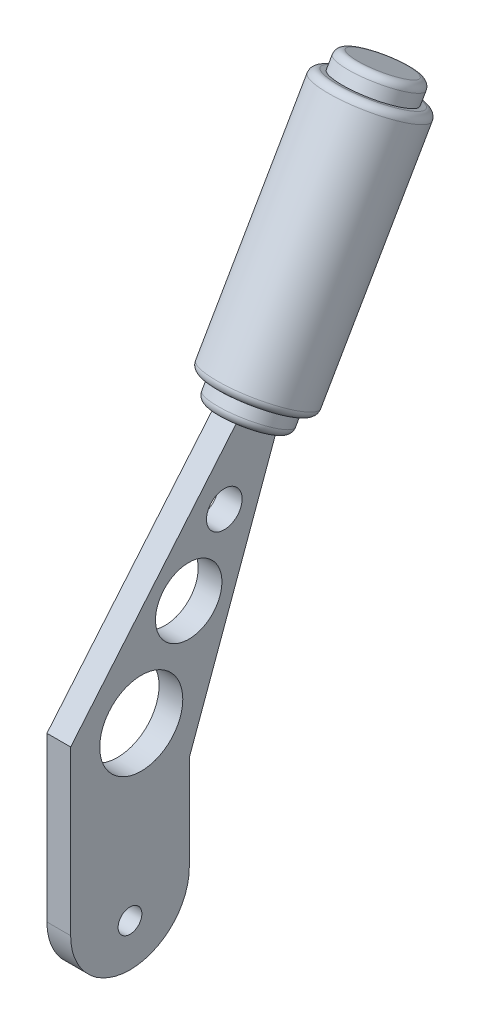
ISO-10303-21;
HEADER;
FILE_DESCRIPTION(('STEP AP214'),'2;1');
FILE_NAME('part.step','',(''),(''),'','','');
FILE_SCHEMA(('AUTOMOTIVE_DESIGN { 1 0 10303 214 1 1 1 1 }'));
ENDSEC;
DATA;
#1=APPLICATION_CONTEXT('core data for automotive mechanical design processes');
#2=APPLICATION_PROTOCOL_DEFINITION('international standard','automotive_design',2000,#1);
#3=PRODUCT_CONTEXT('',#1,'mechanical');
#4=PRODUCT('Part','Part','',(#3));
#5=PRODUCT_RELATED_PRODUCT_CATEGORY('part','',(#4));
#6=PRODUCT_DEFINITION_FORMATION('','',#4);
#7=PRODUCT_DEFINITION_CONTEXT('part definition',#1,'design');
#8=PRODUCT_DEFINITION('design','',#6,#7);
#9=PRODUCT_DEFINITION_SHAPE('','',#8);
#10=(LENGTH_UNIT() NAMED_UNIT(*) SI_UNIT(.MILLI.,.METRE.));
#11=(NAMED_UNIT(*) PLANE_ANGLE_UNIT() SI_UNIT($,.RADIAN.));
#12=(NAMED_UNIT(*) SI_UNIT($,.STERADIAN.) SOLID_ANGLE_UNIT());
#13=UNCERTAINTY_MEASURE_WITH_UNIT(LENGTH_MEASURE(1.E-05),#10,'distance_accuracy_value','');
#14=(GEOMETRIC_REPRESENTATION_CONTEXT(3) GLOBAL_UNCERTAINTY_ASSIGNED_CONTEXT((#13)) GLOBAL_UNIT_ASSIGNED_CONTEXT((#10,
#11,#12)) REPRESENTATION_CONTEXT('',''));
#15=CARTESIAN_POINT('',(0.,0.,0.));
#16=DIRECTION('',(0.,0.,1.));
#17=DIRECTION('',(1.,0.,0.));
#18=AXIS2_PLACEMENT_3D('',#15,#16,#17);
#19=CARTESIAN_POINT('',(-5.,0.,0.));
#20=DIRECTION('',(1.,0.,0.));
#21=DIRECTION('',(0.,0.,-1.));
#22=AXIS2_PLACEMENT_3D('',#19,#20,#21);
#23=CYLINDRICAL_SURFACE('',#22,25.);
#24=DIRECTION('',(1.,0.,0.));
#25=VECTOR('',#24,1.);
#26=CARTESIAN_POINT('',(-5.,0.,-25.));
#27=LINE('',#26,#25);
#28=CARTESIAN_POINT('',(-5.,0.,-25.));
#29=VERTEX_POINT('',#28);
#30=CARTESIAN_POINT('',(5.,0.,-25.));
#31=VERTEX_POINT('',#30);
#32=EDGE_CURVE('E130',#29,#31,#27,.T.);
#33=ORIENTED_EDGE('',*,*,#32,.T.);
#34=CARTESIAN_POINT('',(5.,0.,0.));
#35=DIRECTION('',(1.,0.,0.));
#36=DIRECTION('',(0.,0.,1.));
#37=AXIS2_PLACEMENT_3D('',#34,#35,#36);
#38=CIRCLE('',#37,25.);
#39=CARTESIAN_POINT('',(5.,0.,25.));
#40=VERTEX_POINT('',#39);
#41=EDGE_CURVE('E210',#40,#31,#38,.T.);
#42=ORIENTED_EDGE('',*,*,#41,.F.);
#43=DIRECTION('',(1.,0.,0.));
#44=VECTOR('',#43,1.);
#45=CARTESIAN_POINT('',(-5.,0.,25.));
#46=LINE('',#45,#44);
#47=CARTESIAN_POINT('',(-5.,0.,25.));
#48=VERTEX_POINT('',#47);
#49=EDGE_CURVE('E57',#48,#40,#46,.T.);
#50=ORIENTED_EDGE('',*,*,#49,.F.);
#51=CARTESIAN_POINT('',(-5.,0.,0.));
#52=DIRECTION('',(1.,0.,0.));
#53=DIRECTION('',(0.,0.,1.));
#54=AXIS2_PLACEMENT_3D('',#51,#52,#53);
#55=CIRCLE('',#54,25.);
#56=EDGE_CURVE('E247',#48,#29,#55,.T.);
#57=ORIENTED_EDGE('',*,*,#56,.T.);
#58=EDGE_LOOP('',(#33,#42,#50,#57));
#59=FACE_BOUND('',#58,.T.);
#60=ADVANCED_FACE('F41',(#59),#23,.T.);
#61=CARTESIAN_POINT('',(-5.,0.,25.));
#62=DIRECTION('',(0.,0.,1.));
#63=DIRECTION('',(1.,0.,0.));
#64=AXIS2_PLACEMENT_3D('',#61,#62,#63);
#65=PLANE('',#64);
#66=ORIENTED_EDGE('',*,*,#49,.T.);
#67=DIRECTION('',(0.,-1.,0.));
#68=VECTOR('',#67,1.);
#69=CARTESIAN_POINT('',(5.,0.,25.));
#70=LINE('',#69,#68);
#71=CARTESIAN_POINT('',(5.,68.8675134594813,25.));
#72=VERTEX_POINT('',#71);
#73=EDGE_CURVE('E227',#72,#40,#70,.T.);
#74=ORIENTED_EDGE('',*,*,#73,.F.);
#75=DIRECTION('',(1.,0.,0.));
#76=VECTOR('',#75,1.);
#77=CARTESIAN_POINT('',(-5.,68.8675134594813,25.));
#78=LINE('',#77,#76);
#79=CARTESIAN_POINT('',(-5.,68.8675134594813,25.));
#80=VERTEX_POINT('',#79);
#81=EDGE_CURVE('E65',#80,#72,#78,.T.);
#82=ORIENTED_EDGE('',*,*,#81,.F.);
#83=DIRECTION('',(0.,-1.,0.));
#84=VECTOR('',#83,1.);
#85=CARTESIAN_POINT('',(-5.,0.,25.));
#86=LINE('',#85,#84);
#87=EDGE_CURVE('E103',#80,#48,#86,.T.);
#88=ORIENTED_EDGE('',*,*,#87,.T.);
#89=EDGE_LOOP('',(#66,#74,#82,#88));
#90=FACE_BOUND('',#89,.T.);
#91=ADVANCED_FACE('F259',(#90),#65,.T.);
#92=CARTESIAN_POINT('',(-5.,68.8675134594813,25.));
#93=DIRECTION('',(0.,0.642787609686543,0.766044443118975));
#94=DIRECTION('',(0.,-0.766044443118975,0.642787609686543));
#95=AXIS2_PLACEMENT_3D('',#92,#93,#94);
#96=PLANE('',#95);
#97=ORIENTED_EDGE('',*,*,#81,.T.);
#98=DIRECTION('',(0.,-0.766044443118975,0.642787609686543));
#99=VECTOR('',#98,1.);
#100=CARTESIAN_POINT('',(5.,68.8675134594813,25.));
#101=LINE('',#100,#99);
#102=CARTESIAN_POINT('',(5.,152.101060942083,-44.8412389942287));
#103=VERTEX_POINT('',#102);
#104=EDGE_CURVE('E112',#103,#72,#101,.T.);
#105=ORIENTED_EDGE('',*,*,#104,.F.);
#106=DIRECTION('',(1.,0.,0.));
#107=VECTOR('',#106,1.);
#108=CARTESIAN_POINT('',(-5.,152.101060942083,-44.8412389942287));
#109=LINE('',#108,#107);
#110=CARTESIAN_POINT('',(-5.,152.101060942083,-44.8412389942287));
#111=VERTEX_POINT('',#110);
#112=EDGE_CURVE('E109',#111,#103,#109,.T.);
#113=ORIENTED_EDGE('',*,*,#112,.F.);
#114=DIRECTION('',(0.,-0.766044443118975,0.642787609686543));
#115=VECTOR('',#114,1.);
#116=CARTESIAN_POINT('',(-5.,68.8675134594813,25.));
#117=LINE('',#116,#115);
#118=EDGE_CURVE('E96',#111,#80,#117,.T.);
#119=ORIENTED_EDGE('',*,*,#118,.T.);
#120=EDGE_LOOP('',(#97,#105,#113,#119));
#121=FACE_BOUND('',#120,.T.);
#122=ADVANCED_FACE('F110',(#121),#96,.T.);
#123=CARTESIAN_POINT('',(-5.,142.101060942083,-62.1617470699175));
#124=DIRECTION('',(0.,-0.342020143325666,-0.93969262078591));
#125=DIRECTION('',(0.,0.93969262078591,-0.342020143325666));
#126=AXIS2_PLACEMENT_3D('',#123,#124,#125);
#127=PLANE('',#126);
#128=DIRECTION('',(1.,0.,0.));
#129=VECTOR('',#128,1.);
#130=CARTESIAN_POINT('',(-5.,142.101060942083,-62.1617470699175));
#131=LINE('',#130,#129);
#132=CARTESIAN_POINT('',(-5.,142.101060942083,-62.1617470699175));
#133=VERTEX_POINT('',#132);
#134=CARTESIAN_POINT('',(5.,142.101060942083,-62.1617470699175));
#135=VERTEX_POINT('',#134);
#136=EDGE_CURVE('E116',#133,#135,#131,.T.);
#137=ORIENTED_EDGE('',*,*,#136,.T.);
#138=DIRECTION('',(0.,0.93969262078591,-0.342020143325666));
#139=VECTOR('',#138,1.);
#140=CARTESIAN_POINT('',(5.,142.101060942083,-62.1617470699175));
#141=LINE('',#140,#139);
#142=CARTESIAN_POINT('',(5.,40.,-25.));
#143=VERTEX_POINT('',#142);
#144=EDGE_CURVE('E218',#143,#135,#141,.T.);
#145=ORIENTED_EDGE('',*,*,#144,.F.);
#146=DIRECTION('',(1.,0.,0.));
#147=VECTOR('',#146,1.);
#148=CARTESIAN_POINT('',(-5.,40.,-25.));
#149=LINE('',#148,#147);
#150=CARTESIAN_POINT('',(-5.,40.,-25.));
#151=VERTEX_POINT('',#150);
#152=EDGE_CURVE('E138',#151,#143,#149,.T.);
#153=ORIENTED_EDGE('',*,*,#152,.F.);
#154=DIRECTION('',(0.,0.93969262078591,-0.342020143325666));
#155=VECTOR('',#154,1.);
#156=CARTESIAN_POINT('',(-5.,142.101060942083,-62.1617470699175));
#157=LINE('',#156,#155);
#158=EDGE_CURVE('E121',#151,#133,#157,.T.);
#159=ORIENTED_EDGE('',*,*,#158,.T.);
#160=EDGE_LOOP('',(#137,#145,#153,#159));
#161=FACE_BOUND('',#160,.T.);
#162=ADVANCED_FACE('F266',(#161),#127,.T.);
#163=CARTESIAN_POINT('',(-5.,0.,-25.));
#164=DIRECTION('',(0.,0.,-1.));
#165=DIRECTION('',(-1.,0.,0.));
#166=AXIS2_PLACEMENT_3D('',#163,#164,#165);
#167=PLANE('',#166);
#168=ORIENTED_EDGE('',*,*,#152,.T.);
#169=DIRECTION('',(0.,1.,0.));
#170=VECTOR('',#169,1.);
#171=CARTESIAN_POINT('',(5.,0.,-25.));
#172=LINE('',#171,#170);
#173=EDGE_CURVE('E214',#31,#143,#172,.T.);
#174=ORIENTED_EDGE('',*,*,#173,.F.);
#175=ORIENTED_EDGE('',*,*,#32,.F.);
#176=DIRECTION('',(0.,1.,0.));
#177=VECTOR('',#176,1.);
#178=CARTESIAN_POINT('',(-5.,0.,-25.));
#179=LINE('',#178,#177);
#180=EDGE_CURVE('E124',#29,#151,#179,.T.);
#181=ORIENTED_EDGE('',*,*,#180,.T.);
#182=EDGE_LOOP('',(#168,#174,#175,#181));
#183=FACE_BOUND('',#182,.T.);
#184=ADVANCED_FACE('F253',(#183),#167,.T.);
#185=CARTESIAN_POINT('',(-5.,0.,0.));
#186=DIRECTION('',(-1.,0.,0.));
#187=DIRECTION('',(0.,0.,1.));
#188=AXIS2_PLACEMENT_3D('',#185,#186,#187);
#189=PLANE('',#188);
#190=CARTESIAN_POINT('',(-5.,-7.,0.));
#191=DIRECTION('',(1.,0.,0.));
#192=DIRECTION('',(0.,0.,-1.));
#193=AXIS2_PLACEMENT_3D('',#190,#191,#192);
#194=CIRCLE('',#193,5.);
#195=CARTESIAN_POINT('',(-5.,-7.,-5.));
#196=VERTEX_POINT('',#195);
#197=EDGE_CURVE('E231',#196,#196,#194,.T.);
#198=ORIENTED_EDGE('',*,*,#197,.T.);
#199=EDGE_LOOP('',(#198));
#200=FACE_BOUND('',#199,.T.);
#201=CARTESIAN_POINT('',(-5.,62.6635840731006,-4.75149303207303));
#202=DIRECTION('',(1.,0.,0.));
#203=DIRECTION('',(0.,0.,-1.));
#204=AXIS2_PLACEMENT_3D('',#201,#202,#203);
#205=CIRCLE('',#204,17.5);
#206=CARTESIAN_POINT('',(-5.,62.6635840731006,-22.251493032073));
#207=VERTEX_POINT('',#206);
#208=EDGE_CURVE('E235',#207,#207,#205,.T.);
#209=ORIENTED_EDGE('',*,*,#208,.T.);
#210=EDGE_LOOP('',(#209));
#211=FACE_BOUND('',#210,.T.);
#212=CARTESIAN_POINT('',(-5.,97.3046002244782,-24.751493032073));
#213=DIRECTION('',(1.,0.,0.));
#214=DIRECTION('',(0.,0.,-1.));
#215=AXIS2_PLACEMENT_3D('',#212,#213,#214);
#216=CIRCLE('',#215,14.);
#217=CARTESIAN_POINT('',(-5.,97.3046002244782,-38.7514930320731));
#218=VERTEX_POINT('',#217);
#219=EDGE_CURVE('E239',#218,#218,#216,.T.);
#220=ORIENTED_EDGE('',*,*,#219,.T.);
#221=EDGE_LOOP('',(#220));
#222=FACE_BOUND('',#221,.T.);
#223=CARTESIAN_POINT('',(-5.,123.285362338011,-39.7514930320731));
#224=DIRECTION('',(1.,0.,0.));
#225=DIRECTION('',(0.,0.,-1.));
#226=AXIS2_PLACEMENT_3D('',#223,#224,#225);
#227=CIRCLE('',#226,7.50000000000002);
#228=CARTESIAN_POINT('',(-5.,123.285362338011,-47.2514930320731));
#229=VERTEX_POINT('',#228);
#230=EDGE_CURVE('E243',#229,#229,#227,.T.);
#231=ORIENTED_EDGE('',*,*,#230,.T.);
#232=EDGE_LOOP('',(#231));
#233=FACE_BOUND('',#232,.T.);
#234=ORIENTED_EDGE('',*,*,#56,.F.);
#235=ORIENTED_EDGE('',*,*,#87,.F.);
#236=ORIENTED_EDGE('',*,*,#118,.F.);
#237=DIRECTION('',(0.,0.5,0.866025403784438));
#238=VECTOR('',#237,1.);
#239=CARTESIAN_POINT('',(-5.,152.101060942083,-44.8412389942287));
#240=LINE('',#239,#238);
#241=EDGE_CURVE('E101',#133,#111,#240,.T.);
#242=ORIENTED_EDGE('',*,*,#241,.F.);
#243=ORIENTED_EDGE('',*,*,#158,.F.);
#244=ORIENTED_EDGE('',*,*,#180,.F.);
#245=EDGE_LOOP('',(#234,#235,#236,#242,#243,#244));
#246=FACE_BOUND('',#245,.T.);
#247=ADVANCED_FACE('F98',(#200,#211,#222,#233,#246),#189,.T.);
#248=CARTESIAN_POINT('',(-5.,123.285362338011,-39.7514930320731));
#249=DIRECTION('',(1.,0.,0.));
#250=DIRECTION('',(0.,0.,-1.));
#251=AXIS2_PLACEMENT_3D('',#248,#249,#250);
#252=CYLINDRICAL_SURFACE('',#251,7.50000000000002);
#253=ORIENTED_EDGE('',*,*,#230,.F.);
#254=EDGE_LOOP('',(#253));
#255=FACE_BOUND('',#254,.T.);
#256=CARTESIAN_POINT('',(5.,123.285362338011,-39.7514930320731));
#257=DIRECTION('',(1.,0.,0.));
#258=DIRECTION('',(0.,0.,-1.));
#259=AXIS2_PLACEMENT_3D('',#256,#257,#258);
#260=CIRCLE('',#259,7.50000000000002);
#261=CARTESIAN_POINT('',(5.,123.285362338011,-47.2514930320731));
#262=VERTEX_POINT('',#261);
#263=EDGE_CURVE('E206',#262,#262,#260,.T.);
#264=ORIENTED_EDGE('',*,*,#263,.T.);
#265=EDGE_LOOP('',(#264));
#266=FACE_BOUND('',#265,.T.);
#267=ADVANCED_FACE('F323',(#255,#266),#252,.F.);
#268=CARTESIAN_POINT('',(-5.,97.3046002244782,-24.751493032073));
#269=DIRECTION('',(1.,0.,0.));
#270=DIRECTION('',(0.,0.,-1.));
#271=AXIS2_PLACEMENT_3D('',#268,#269,#270);
#272=CYLINDRICAL_SURFACE('',#271,14.);
#273=ORIENTED_EDGE('',*,*,#219,.F.);
#274=EDGE_LOOP('',(#273));
#275=FACE_BOUND('',#274,.T.);
#276=CARTESIAN_POINT('',(5.,97.3046002244782,-24.751493032073));
#277=DIRECTION('',(1.,0.,0.));
#278=DIRECTION('',(0.,0.,-1.));
#279=AXIS2_PLACEMENT_3D('',#276,#277,#278);
#280=CIRCLE('',#279,14.);
#281=CARTESIAN_POINT('',(5.,97.3046002244782,-38.7514930320731));
#282=VERTEX_POINT('',#281);
#283=EDGE_CURVE('E202',#282,#282,#280,.T.);
#284=ORIENTED_EDGE('',*,*,#283,.T.);
#285=EDGE_LOOP('',(#284));
#286=FACE_BOUND('',#285,.T.);
#287=ADVANCED_FACE('F320',(#275,#286),#272,.F.);
#288=CARTESIAN_POINT('',(-5.,62.6635840731006,-4.75149303207303));
#289=DIRECTION('',(1.,0.,0.));
#290=DIRECTION('',(0.,0.,-1.));
#291=AXIS2_PLACEMENT_3D('',#288,#289,#290);
#292=CYLINDRICAL_SURFACE('',#291,17.5);
#293=ORIENTED_EDGE('',*,*,#208,.F.);
#294=EDGE_LOOP('',(#293));
#295=FACE_BOUND('',#294,.T.);
#296=CARTESIAN_POINT('',(5.,62.6635840731006,-4.75149303207303));
#297=DIRECTION('',(1.,0.,0.));
#298=DIRECTION('',(0.,0.,-1.));
#299=AXIS2_PLACEMENT_3D('',#296,#297,#298);
#300=CIRCLE('',#299,17.5);
#301=CARTESIAN_POINT('',(5.,62.6635840731006,-22.251493032073));
#302=VERTEX_POINT('',#301);
#303=EDGE_CURVE('E198',#302,#302,#300,.T.);
#304=ORIENTED_EDGE('',*,*,#303,.T.);
#305=EDGE_LOOP('',(#304));
#306=FACE_BOUND('',#305,.T.);
#307=ADVANCED_FACE('F316',(#295,#306),#292,.F.);
#308=CARTESIAN_POINT('',(-5.,-7.,0.));
#309=DIRECTION('',(1.,0.,0.));
#310=DIRECTION('',(0.,0.,-1.));
#311=AXIS2_PLACEMENT_3D('',#308,#309,#310);
#312=CYLINDRICAL_SURFACE('',#311,5.);
#313=ORIENTED_EDGE('',*,*,#197,.F.);
#314=EDGE_LOOP('',(#313));
#315=FACE_BOUND('',#314,.T.);
#316=CARTESIAN_POINT('',(5.,-7.,0.));
#317=DIRECTION('',(1.,0.,0.));
#318=DIRECTION('',(0.,0.,-1.));
#319=AXIS2_PLACEMENT_3D('',#316,#317,#318);
#320=CIRCLE('',#319,5.);
#321=CARTESIAN_POINT('',(5.,-7.,-5.));
#322=VERTEX_POINT('',#321);
#323=EDGE_CURVE('E192',#322,#322,#320,.T.);
#324=ORIENTED_EDGE('',*,*,#323,.T.);
#325=EDGE_LOOP('',(#324));
#326=FACE_BOUND('',#325,.T.);
#327=ADVANCED_FACE('F299',(#315,#326),#312,.F.);
#328=CARTESIAN_POINT('',(5.,0.,0.));
#329=DIRECTION('',(-1.,0.,0.));
#330=DIRECTION('',(0.,0.,1.));
#331=AXIS2_PLACEMENT_3D('',#328,#329,#330);
#332=PLANE('',#331);
#333=ORIENTED_EDGE('',*,*,#41,.T.);
#334=ORIENTED_EDGE('',*,*,#173,.T.);
#335=ORIENTED_EDGE('',*,*,#144,.T.);
#336=DIRECTION('',(0.,0.5,0.866025403784438));
#337=VECTOR('',#336,1.);
#338=CARTESIAN_POINT('',(5.,152.101060942083,-44.8412389942287));
#339=LINE('',#338,#337);
#340=EDGE_CURVE('E222',#135,#103,#339,.T.);
#341=ORIENTED_EDGE('',*,*,#340,.T.);
#342=ORIENTED_EDGE('',*,*,#104,.T.);
#343=ORIENTED_EDGE('',*,*,#73,.T.);
#344=EDGE_LOOP('',(#333,#334,#335,#341,#342,#343));
#345=FACE_BOUND('',#344,.T.);
#346=ORIENTED_EDGE('',*,*,#263,.F.);
#347=EDGE_LOOP('',(#346));
#348=FACE_BOUND('',#347,.T.);
#349=ORIENTED_EDGE('',*,*,#283,.F.);
#350=EDGE_LOOP('',(#349));
#351=FACE_BOUND('',#350,.T.);
#352=ORIENTED_EDGE('',*,*,#303,.F.);
#353=EDGE_LOOP('',(#352));
#354=FACE_BOUND('',#353,.T.);
#355=ORIENTED_EDGE('',*,*,#323,.F.);
#356=EDGE_LOOP('',(#355));
#357=FACE_BOUND('',#356,.T.);
#358=ADVANCED_FACE('F257',(#345,#348,#351,#354,#357),#332,.F.);
#359=CARTESIAN_POINT('',(0.,154.601060942083,-40.5111119753066));
#360=DIRECTION('',(0.,0.866025403784438,-0.5));
#361=DIRECTION('',(0.,0.5,0.866025403784439));
#362=AXIS2_PLACEMENT_3D('',#359,#360,#361);
#363=PLANE('',#362);
#364=CARTESIAN_POINT('',(0.,147.101060942083,-53.5014930320731));
#365=DIRECTION('',(0.,0.866025403784438,-0.5));
#366=DIRECTION('',(0.,0.5,0.866025403784439));
#367=AXIS2_PLACEMENT_3D('',#364,#365,#366);
#368=CIRCLE('',#367,12.);
#369=CARTESIAN_POINT('',(0.,153.101060942083,-43.1091881866599));
#370=VERTEX_POINT('',#369);
#371=EDGE_CURVE('E150',#370,#370,#368,.F.);
#372=ORIENTED_EDGE('',*,*,#371,.T.);
#373=EDGE_LOOP('',(#372));
#374=FACE_BOUND('',#373,.T.);
#375=ORIENTED_EDGE('',*,*,#241,.T.);
#376=ORIENTED_EDGE('',*,*,#112,.T.);
#377=ORIENTED_EDGE('',*,*,#340,.F.);
#378=ORIENTED_EDGE('',*,*,#136,.F.);
#379=EDGE_LOOP('',(#375,#376,#377,#378));
#380=FACE_BOUND('',#379,.T.);
#381=ADVANCED_FACE('F119',(#374,#380),#363,.F.);
#382=CARTESIAN_POINT('',(0.,255.060007781078,-98.5111119753066));
#383=DIRECTION('',(0.,-0.866025403784438,0.5));
#384=DIRECTION('',(0.,-0.5,-0.866025403784439));
#385=AXIS2_PLACEMENT_3D('',#382,#383,#384);
#386=PLANE('',#385);
#387=CARTESIAN_POINT('',(0.,247.560007781078,-111.501493032073));
#388=DIRECTION('',(0.,-0.866025403784438,0.5));
#389=DIRECTION('',(0.,-0.5,-0.866025403784439));
#390=AXIS2_PLACEMENT_3D('',#387,#388,#389);
#391=CIRCLE('',#390,12.);
#392=CARTESIAN_POINT('',(0.,241.560007781078,-121.893797877486));
#393=VERTEX_POINT('',#392);
#394=EDGE_CURVE('E146',#393,#393,#391,.F.);
#395=ORIENTED_EDGE('',*,*,#394,.T.);
#396=EDGE_LOOP('',(#395));
#397=FACE_BOUND('',#396,.T.);
#398=ADVANCED_FACE('F290',(#397),#386,.F.);
#399=CARTESIAN_POINT('',(0.,147.101060942083,-53.5014930320731));
#400=DIRECTION('',(0.,-0.866025403784438,0.5));
#401=DIRECTION('',(0.,-0.5,-0.866025403784439));
#402=AXIS2_PLACEMENT_3D('',#399,#400,#401);
#403=CYLINDRICAL_SURFACE('',#402,15.);
#404=CARTESIAN_POINT('',(0.,244.961931569725,-110.001493032073));
#405=DIRECTION('',(0.,-0.866025403784438,0.5));
#406=DIRECTION('',(0.,-0.5,-0.866025403784439));
#407=AXIS2_PLACEMENT_3D('',#404,#405,#406);
#408=CIRCLE('',#407,15.);
#409=CARTESIAN_POINT('',(0.,237.461931569725,-122.99187408884));
#410=VERTEX_POINT('',#409);
#411=EDGE_CURVE('E133',#410,#410,#408,.T.);
#412=CARTESIAN_POINT('',(0.,240.631804550803,-107.501493032073));
#413=DIRECTION('',(0.,-0.866025403784438,0.5));
#414=DIRECTION('',(0.,-0.5,-0.866025403784439));
#415=AXIS2_PLACEMENT_3D('',#412,#413,#414);
#416=CIRCLE('',#415,15.);
#417=CARTESIAN_POINT('',(0.,233.131804550803,-120.49187408884));
#418=VERTEX_POINT('',#417);
#419=EDGE_CURVE('E188',#418,#418,#416,.T.);
#420=CARTESIAN_POINT('',(0.,237.461931569725,-122.99187408884));
#421=CARTESIAN_POINT('',(0.,237.416826079945,-122.965832422173));
#422=CARTESIAN_POINT('',(0.,237.371720590164,-122.939790755506));
#423=CARTESIAN_POINT('',(0.,237.281509610603,-122.887707422173));
#424=CARTESIAN_POINT('',(0.,237.236404120823,-122.861665755506));
#425=CARTESIAN_POINT('',(0.,237.146193141262,-122.809582422173));
#426=CARTESIAN_POINT('',(0.,237.101087651481,-122.783540755506));
#427=CARTESIAN_POINT('',(0.,237.010876671921,-122.731457422173));
#428=CARTESIAN_POINT('',(0.,236.96577118214,-122.705415755506));
#429=CARTESIAN_POINT('',(0.,236.875560202579,-122.653332422173));
#430=CARTESIAN_POINT('',(0.,236.830454712799,-122.627290755506));
#431=CARTESIAN_POINT('',(0.,236.740243733238,-122.575207422173));
#432=CARTESIAN_POINT('',(0.,236.695138243457,-122.549165755506));
#433=CARTESIAN_POINT('',(0.,236.604927263897,-122.497082422173));
#434=CARTESIAN_POINT('',(0.,236.559821774116,-122.471040755506));
#435=CARTESIAN_POINT('',(0.,236.469610794555,-122.418957422173));
#436=CARTESIAN_POINT('',(0.,236.424505304775,-122.392915755506));
#437=CARTESIAN_POINT('',(0.,236.334294325214,-122.340832422173));
#438=CARTESIAN_POINT('',(0.,236.289188835434,-122.314790755506));
#439=CARTESIAN_POINT('',(0.,236.198977855873,-122.262707422173));
#440=CARTESIAN_POINT('',(0.,236.153872366092,-122.236665755506));
#441=CARTESIAN_POINT('',(0.,236.063661386531,-122.184582422173));
#442=CARTESIAN_POINT('',(0.,236.018555896751,-122.158540755506));
#443=CARTESIAN_POINT('',(0.,235.92834491719,-122.106457422173));
#444=CARTESIAN_POINT('',(0.,235.88323942741,-122.080415755506));
#445=CARTESIAN_POINT('',(0.,235.793028447849,-122.028332422173));
#446=CARTESIAN_POINT('',(0.,235.747922958068,-122.002290755506));
#447=CARTESIAN_POINT('',(0.,235.657711978507,-121.950207422173));
#448=CARTESIAN_POINT('',(0.,235.612606488727,-121.924165755506));
#449=CARTESIAN_POINT('',(0.,235.522395509166,-121.872082422173));
#450=CARTESIAN_POINT('',(0.,235.477290019386,-121.846040755506));
#451=CARTESIAN_POINT('',(0.,235.387079039825,-121.793957422173));
#452=CARTESIAN_POINT('',(0.,235.341973550044,-121.767915755506));
#453=CARTESIAN_POINT('',(0.,235.251762570483,-121.715832422173));
#454=CARTESIAN_POINT('',(0.,235.206657080703,-121.689790755506));
#455=CARTESIAN_POINT('',(0.,235.116446101142,-121.637707422173));
#456=CARTESIAN_POINT('',(0.,235.071340611362,-121.611665755506));
#457=CARTESIAN_POINT('',(0.,234.981129631801,-121.559582422173));
#458=CARTESIAN_POINT('',(0.,234.93602414202,-121.533540755506));
#459=CARTESIAN_POINT('',(0.,234.845813162459,-121.481457422173));
#460=CARTESIAN_POINT('',(0.,234.800707672679,-121.455415755506));
#461=CARTESIAN_POINT('',(0.,234.710496693118,-121.403332422173));
#462=CARTESIAN_POINT('',(0.,234.665391203338,-121.377290755506));
#463=CARTESIAN_POINT('',(0.,234.575180223777,-121.325207422173));
#464=CARTESIAN_POINT('',(0.,234.530074733996,-121.299165755506));
#465=CARTESIAN_POINT('',(0.,234.439863754435,-121.247082422173));
#466=CARTESIAN_POINT('',(0.,234.394758264655,-121.221040755506));
#467=CARTESIAN_POINT('',(0.,234.304547285094,-121.168957422173));
#468=CARTESIAN_POINT('',(0.,234.259441795314,-121.142915755506));
#469=CARTESIAN_POINT('',(0.,234.169230815753,-121.090832422173));
#470=CARTESIAN_POINT('',(0.,234.124125325972,-121.064790755506));
#471=CARTESIAN_POINT('',(0.,234.033914346412,-121.012707422173));
#472=CARTESIAN_POINT('',(0.,233.988808856631,-120.986665755506));
#473=CARTESIAN_POINT('',(0.,233.89859787707,-120.934582422173));
#474=CARTESIAN_POINT('',(0.,233.85349238729,-120.908540755506));
#475=CARTESIAN_POINT('',(0.,233.763281407729,-120.856457422173));
#476=CARTESIAN_POINT('',(0.,233.718175917948,-120.830415755506));
#477=CARTESIAN_POINT('',(0.,233.627964938388,-120.778332422173));
#478=CARTESIAN_POINT('',(0.,233.582859448607,-120.752290755506));
#479=CARTESIAN_POINT('',(0.,233.492648469046,-120.700207422173));
#480=CARTESIAN_POINT('',(0.,233.447542979266,-120.674165755506));
#481=CARTESIAN_POINT('',(0.,233.357331999705,-120.622082422173));
#482=CARTESIAN_POINT('',(0.,233.312226509924,-120.596040755506));
#483=CARTESIAN_POINT('',(0.,233.222015530364,-120.543957422173));
#484=CARTESIAN_POINT('',(0.,233.176910040583,-120.517915755506));
#485=CARTESIAN_POINT('',(0.,233.131804550803,-120.49187408884));
#486=B_SPLINE_CURVE_WITH_KNOTS('',3,(#420,#421,#422,#423,#424,#425,#426,#427,#428,#429,#430,
#431,#432,#433,#434,#435,#436,#437,#438,#439,#440,#441,#442,#443,#444,#445,#446,#447,#448,#449,
#450,#451,#452,#453,#454,#455,#456,#457,#458,#459,#460,#461,#462,#463,#464,#465,#466,#467,#468,
#469,#470,#471,#472,#473,#474,#475,#476,#477,#478,#479,#480,#481,#482,#483,#484,#485),
.UNSPECIFIED.,.F.,.F.,(4,2,2,2,2,2,2,2,2,2,2,2,2,2,2,2,2,2,2,2,2,2,2,2,2,2,2,2,2,2,2,2,4),(0.,
0.156249999999994,0.312500000000018,0.468750000000005,0.625000000000006,0.781250000000024,
0.937500000000017,1.09375000000002,1.25000000000003,1.40625000000001,1.56250000000002,
1.71875000000004,1.87500000000001,2.03125000000003,2.18750000000003,2.34375000000002,
2.50000000000004,2.65625000000003,2.81250000000003,2.96875000000005,3.12500000000005,
3.28125000000004,3.43750000000006,3.59375000000005,3.75000000000005,3.90625000000005,
4.06250000000004,4.21875000000006,4.37500000000005,4.53125000000005,4.68750000000007,
4.84375000000006,5.00000000000006),.UNSPECIFIED.);
#487=EDGE_CURVE('BSEAM296',#410,#418,#486,.T.);
#488=ORIENTED_EDGE('',*,*,#411,.T.);
#489=ORIENTED_EDGE('',*,*,#419,.F.);
#490=ORIENTED_EDGE('',*,*,#487,.T.);
#491=ORIENTED_EDGE('',*,*,#487,.F.);
#492=EDGE_LOOP('',(#488,#490,#489,#491));
#493=FACE_BOUND('',#492,.T.);
#494=ADVANCED_FACE('F296',(#493),#403,.T.);
#495=CARTESIAN_POINT('',(0.,250.631804550803,-90.1809849563844));
#496=DIRECTION('',(0.,-0.866025403784438,0.5));
#497=DIRECTION('',(0.,-0.5,-0.866025403784439));
#498=AXIS2_PLACEMENT_3D('',#495,#496,#497);
#499=PLANE('',#498);
#500=CARTESIAN_POINT('',(0.,240.631804550803,-107.501493032073));
#501=DIRECTION('',(0.,-0.866025403784438,0.5));
#502=DIRECTION('',(0.,-0.5,-0.866025403784439));
#503=AXIS2_PLACEMENT_3D('',#500,#501,#502);
#504=CIRCLE('',#503,17.);
#505=CARTESIAN_POINT('',(0.,232.131804550803,-122.223924896409));
#506=VERTEX_POINT('',#505);
#507=EDGE_CURVE('E11',#506,#506,#504,.F.);
#508=ORIENTED_EDGE('',*,*,#507,.T.);
#509=EDGE_LOOP('',(#508));
#510=FACE_BOUND('',#509,.T.);
#511=ORIENTED_EDGE('',*,*,#419,.T.);
#512=EDGE_LOOP('',(#511));
#513=FACE_BOUND('',#512,.T.);
#514=ADVANCED_FACE('F307',(#510,#513),#499,.F.);
#515=CARTESIAN_POINT('',(0.,147.101060942083,-53.5014930320731));
#516=DIRECTION('',(0.,-0.866025403784438,0.5));
#517=DIRECTION('',(0.,-0.5,-0.866025403784439));
#518=AXIS2_PLACEMENT_3D('',#515,#516,#517);
#519=CYLINDRICAL_SURFACE('',#518,20.);
#520=CARTESIAN_POINT('',(0.,156.627340383712,-59.0014930320731));
#521=DIRECTION('',(0.,0.866025403784438,-0.5));
#522=DIRECTION('',(0.,0.5,0.866025403784439));
#523=AXIS2_PLACEMENT_3D('',#520,#521,#522);
#524=CIRCLE('',#523,20.);
#525=CARTESIAN_POINT('',(0.,146.627340383712,-76.3220011077619));
#526=VERTEX_POINT('',#525);
#527=EDGE_CURVE('E50',#526,#526,#524,.T.);
#528=CARTESIAN_POINT('',(0.,238.033728339449,-106.001493032073));
#529=DIRECTION('',(0.,-0.866025403784438,0.5));
#530=DIRECTION('',(0.,-0.5,-0.866025403784439));
#531=AXIS2_PLACEMENT_3D('',#528,#529,#530);
#532=CIRCLE('',#531,20.);
#533=CARTESIAN_POINT('',(0.,228.033728339449,-123.322001107762));
#534=VERTEX_POINT('',#533);
#535=EDGE_CURVE('E162',#534,#534,#532,.T.);
#536=CARTESIAN_POINT('',(0.,146.627340383712,-76.3220011077619));
#537=CARTESIAN_POINT('',(0.,147.475323591584,-76.8115844410953));
#538=CARTESIAN_POINT('',(0.,148.323306799457,-77.3011677744286));
#539=CARTESIAN_POINT('',(0.,150.019273215201,-78.2803344410953));
#540=CARTESIAN_POINT('',(0.,150.867256423073,-78.7699177744286));
#541=CARTESIAN_POINT('',(0.,152.563222838818,-79.7490844410952));
#542=CARTESIAN_POINT('',(0.,153.41120604669,-80.2386677744286));
#543=CARTESIAN_POINT('',(0.,155.107172462435,-81.2178344410953));
#544=CARTESIAN_POINT('',(0.,155.955155670307,-81.7074177744286));
#545=CARTESIAN_POINT('',(0.,157.651122086052,-82.6865844410953));
#546=CARTESIAN_POINT('',(0.,158.499105293924,-83.1761677744286));
#547=CARTESIAN_POINT('',(0.,160.195071709668,-84.1553344410952));
#548=CARTESIAN_POINT('',(0.,161.043054917541,-84.6449177744286));
#549=CARTESIAN_POINT('',(0.,162.739021333285,-85.6240844410953));
#550=CARTESIAN_POINT('',(0.,163.587004541157,-86.1136677744286));
#551=CARTESIAN_POINT('',(0.,165.282970956902,-87.0928344410953));
#552=CARTESIAN_POINT('',(0.,166.130954164774,-87.5824177744286));
#553=CARTESIAN_POINT('',(0.,167.826920580519,-88.5615844410953));
#554=CARTESIAN_POINT('',(0.,168.674903788391,-89.0511677744286));
#555=CARTESIAN_POINT('',(0.,170.370870204136,-90.0303344410953));
#556=CARTESIAN_POINT('',(0.,171.218853412008,-90.5199177744286));
#557=CARTESIAN_POINT('',(0.,172.914819827752,-91.4990844410953));
#558=CARTESIAN_POINT('',(0.,173.762803035625,-91.9886677744286));
#559=CARTESIAN_POINT('',(0.,175.458769451369,-92.9678344410953));
#560=CARTESIAN_POINT('',(0.,176.306752659241,-93.4574177744286));
#561=CARTESIAN_POINT('',(0.,178.002719074986,-94.4365844410953));
#562=CARTESIAN_POINT('',(0.,178.850702282858,-94.9261677744286));
#563=CARTESIAN_POINT('',(0.,180.546668698603,-95.9053344410953));
#564=CARTESIAN_POINT('',(0.,181.394651906475,-96.3949177744286));
#565=CARTESIAN_POINT('',(0.,183.090618322219,-97.3740844410953));
#566=CARTESIAN_POINT('',(0.,183.938601530092,-97.8636677744286));
#567=CARTESIAN_POINT('',(0.,185.634567945836,-98.8428344410953));
#568=CARTESIAN_POINT('',(0.,186.482551153709,-99.3324177744286));
#569=CARTESIAN_POINT('',(0.,188.178517569453,-100.311584441095));
#570=CARTESIAN_POINT('',(0.,189.026500777325,-100.801167774429));
#571=CARTESIAN_POINT('',(0.,190.72246719307,-101.780334441095));
#572=CARTESIAN_POINT('',(0.,191.570450400942,-102.269917774429));
#573=CARTESIAN_POINT('',(0.,193.266416816687,-103.249084441095));
#574=CARTESIAN_POINT('',(0.,194.114400024559,-103.738667774429));
#575=CARTESIAN_POINT('',(0.,195.810366440303,-104.717834441095));
#576=CARTESIAN_POINT('',(0.,196.658349648176,-105.207417774429));
#577=CARTESIAN_POINT('',(0.,198.35431606392,-106.186584441095));
#578=CARTESIAN_POINT('',(0.,199.202299271792,-106.676167774429));
#579=CARTESIAN_POINT('',(0.,200.898265687537,-107.655334441095));
#580=CARTESIAN_POINT('',(0.,201.746248895409,-108.144917774429));
#581=CARTESIAN_POINT('',(0.,203.442215311154,-109.124084441095));
#582=CARTESIAN_POINT('',(0.,204.290198519026,-109.613667774429));
#583=CARTESIAN_POINT('',(0.,205.986164934771,-110.592834441095));
#584=CARTESIAN_POINT('',(0.,206.834148142643,-111.082417774429));
#585=CARTESIAN_POINT('',(0.,208.530114558387,-112.061584441095));
#586=CARTESIAN_POINT('',(0.,209.37809776626,-112.551167774429));
#587=CARTESIAN_POINT('',(0.,211.074064182004,-113.530334441095));
#588=CARTESIAN_POINT('',(0.,211.922047389876,-114.019917774429));
#589=CARTESIAN_POINT('',(0.,213.618013805621,-114.999084441095));
#590=CARTESIAN_POINT('',(0.,214.465997013493,-115.488667774429));
#591=CARTESIAN_POINT('',(0.,216.161963429238,-116.467834441095));
#592=CARTESIAN_POINT('',(0.,217.00994663711,-116.957417774429));
#593=CARTESIAN_POINT('',(0.,218.705913052855,-117.936584441095));
#594=CARTESIAN_POINT('',(0.,219.553896260727,-118.426167774429));
#595=CARTESIAN_POINT('',(0.,221.249862676471,-119.405334441095));
#596=CARTESIAN_POINT('',(0.,222.097845884344,-119.894917774429));
#597=CARTESIAN_POINT('',(0.,223.793812300088,-120.874084441095));
#598=CARTESIAN_POINT('',(0.,224.64179550796,-121.363667774429));
#599=CARTESIAN_POINT('',(0.,226.337761923705,-122.342834441095));
#600=CARTESIAN_POINT('',(0.,227.185745131577,-122.832417774429));
#601=CARTESIAN_POINT('',(0.,228.033728339449,-123.322001107762));
#602=B_SPLINE_CURVE_WITH_KNOTS('',3,(#536,#537,#538,#539,#540,#541,#542,#543,#544,#545,#546,
#547,#548,#549,#550,#551,#552,#553,#554,#555,#556,#557,#558,#559,#560,#561,#562,#563,#564,#565,
#566,#567,#568,#569,#570,#571,#572,#573,#574,#575,#576,#577,#578,#579,#580,#581,#582,#583,#584,
#585,#586,#587,#588,#589,#590,#591,#592,#593,#594,#595,#596,#597,#598,#599,#600,#601),
.UNSPECIFIED.,.F.,.F.,(4,2,2,2,2,2,2,2,2,2,2,2,2,2,2,2,2,2,2,2,2,2,2,2,2,2,2,2,2,2,2,2,4),(0.,
2.93750000000003,5.87500000000002,8.81250000000002,11.75,14.6875,17.625,20.5625,23.5,26.4375,
29.375,32.3125,35.25,38.1875,41.125,44.0625,47.,49.9375,52.875,55.8125,58.75,61.6875,64.625,
67.5625,70.5,73.4375,76.3750000000001,79.3125,82.25,85.1875,88.125,91.0625,94.),.UNSPECIFIED.);
#603=EDGE_CURVE('BSEAM169',#526,#534,#602,.T.);
#604=ORIENTED_EDGE('',*,*,#527,.T.);
#605=ORIENTED_EDGE('',*,*,#535,.T.);
#606=ORIENTED_EDGE('',*,*,#603,.T.);
#607=ORIENTED_EDGE('',*,*,#603,.F.);
#608=EDGE_LOOP('',(#604,#606,#605,#607));
#609=FACE_BOUND('',#608,.T.);
#610=ADVANCED_FACE('F169',(#609),#519,.T.);
#611=CARTESIAN_POINT('',(0.,161.529264172359,-44.5111119753066));
#612=DIRECTION('',(0.,0.866025403784438,-0.5));
#613=DIRECTION('',(0.,0.5,0.866025403784439));
#614=AXIS2_PLACEMENT_3D('',#611,#612,#613);
#615=PLANE('',#614);
#616=CARTESIAN_POINT('',(0.,154.029264172359,-57.5014930320731));
#617=DIRECTION('',(0.,0.866025403784438,-0.5));
#618=DIRECTION('',(0.,0.5,0.866025403784439));
#619=AXIS2_PLACEMENT_3D('',#616,#617,#618);
#620=CIRCLE('',#619,17.);
#621=CARTESIAN_POINT('',(0.,162.529264172359,-42.7790611677377));
#622=VERTEX_POINT('',#621);
#623=EDGE_CURVE('E158',#622,#622,#620,.F.);
#624=ORIENTED_EDGE('',*,*,#623,.T.);
#625=EDGE_LOOP('',(#624));
#626=FACE_BOUND('',#625,.T.);
#627=CARTESIAN_POINT('',(0.,154.029264172359,-57.5014930320731));
#628=DIRECTION('',(0.,-0.866025403784438,0.5));
#629=DIRECTION('',(0.,-0.5,-0.866025403784439));
#630=AXIS2_PLACEMENT_3D('',#627,#628,#629);
#631=CIRCLE('',#630,15.);
#632=CARTESIAN_POINT('',(0.,146.529264172359,-70.4918740888397));
#633=VERTEX_POINT('',#632);
#634=EDGE_CURVE('E185',#633,#633,#631,.T.);
#635=ORIENTED_EDGE('',*,*,#634,.F.);
#636=EDGE_LOOP('',(#635));
#637=FACE_BOUND('',#636,.T.);
#638=ADVANCED_FACE('F178',(#626,#637),#615,.F.);
#639=CARTESIAN_POINT('',(0.,147.101060942083,-53.5014930320731));
#640=DIRECTION('',(0.,-0.866025403784438,0.5));
#641=DIRECTION('',(0.,-0.5,-0.866025403784439));
#642=AXIS2_PLACEMENT_3D('',#639,#640,#641);
#643=CYLINDRICAL_SURFACE('',#642,15.);
#644=CARTESIAN_POINT('',(0.,149.699137153437,-55.0014930320731));
#645=DIRECTION('',(0.,0.866025403784438,-0.5));
#646=DIRECTION('',(0.,0.5,0.866025403784439));
#647=AXIS2_PLACEMENT_3D('',#644,#645,#646);
#648=CIRCLE('',#647,15.);
#649=CARTESIAN_POINT('',(0.,142.199137153437,-67.9918740888397));
#650=VERTEX_POINT('',#649);
#651=EDGE_CURVE('E154',#650,#650,#648,.T.);
#652=CARTESIAN_POINT('',(0.,142.199137153437,-67.9918740888397));
#653=CARTESIAN_POINT('',(0.,142.244242643217,-68.0179157555064));
#654=CARTESIAN_POINT('',(0.,142.289348132998,-68.0439574221731));
#655=CARTESIAN_POINT('',(0.,142.379559112558,-68.0960407555064));
#656=CARTESIAN_POINT('',(0.,142.424664602339,-68.1220824221731));
#657=CARTESIAN_POINT('',(0.,142.5148755819,-68.1741657555064));
#658=CARTESIAN_POINT('',(0.,142.55998107168,-68.2002074221731));
#659=CARTESIAN_POINT('',(0.,142.650192051241,-68.2522907555064));
#660=CARTESIAN_POINT('',(0.,142.695297541022,-68.278332422173));
#661=CARTESIAN_POINT('',(0.,142.785508520582,-68.3304157555064));
#662=CARTESIAN_POINT('',(0.,142.830614010363,-68.356457422173));
#663=CARTESIAN_POINT('',(0.,142.920824989924,-68.4085407555064));
#664=CARTESIAN_POINT('',(0.,142.965930479704,-68.434582422173));
#665=CARTESIAN_POINT('',(0.,143.056141459265,-68.4866657555064));
#666=CARTESIAN_POINT('',(0.,143.101246949045,-68.5127074221731));
#667=CARTESIAN_POINT('',(0.,143.191457928606,-68.5647907555064));
#668=CARTESIAN_POINT('',(0.,143.236563418387,-68.590832422173));
#669=CARTESIAN_POINT('',(0.,143.326774397948,-68.6429157555064));
#670=CARTESIAN_POINT('',(0.,143.371879887728,-68.668957422173));
#671=CARTESIAN_POINT('',(0.,143.462090867289,-68.7210407555064));
#672=CARTESIAN_POINT('',(0.,143.507196357069,-68.747082422173));
#673=CARTESIAN_POINT('',(0.,143.59740733663,-68.7991657555064));
#674=CARTESIAN_POINT('',(0.,143.642512826411,-68.8252074221731));
#675=CARTESIAN_POINT('',(0.,143.732723805972,-68.8772907555064));
#676=CARTESIAN_POINT('',(0.,143.777829295752,-68.9033324221731));
#677=CARTESIAN_POINT('',(0.,143.868040275313,-68.9554157555064));
#678=CARTESIAN_POINT('',(0.,143.913145765093,-68.981457422173));
#679=CARTESIAN_POINT('',(0.,144.003356744654,-69.0335407555064));
#680=CARTESIAN_POINT('',(0.,144.048462234435,-69.059582422173));
#681=CARTESIAN_POINT('',(0.,144.138673213996,-69.1116657555064));
#682=CARTESIAN_POINT('',(0.,144.183778703776,-69.137707422173));
#683=CARTESIAN_POINT('',(0.,144.273989683337,-69.1897907555064));
#684=CARTESIAN_POINT('',(0.,144.319095173117,-69.215832422173));
#685=CARTESIAN_POINT('',(0.,144.409306152678,-69.2679157555064));
#686=CARTESIAN_POINT('',(0.,144.454411642459,-69.2939574221731));
#687=CARTESIAN_POINT('',(0.,144.54462262202,-69.3460407555064));
#688=CARTESIAN_POINT('',(0.,144.5897281118,-69.372082422173));
#689=CARTESIAN_POINT('',(0.,144.679939091361,-69.4241657555064));
#690=CARTESIAN_POINT('',(0.,144.725044581141,-69.450207422173));
#691=CARTESIAN_POINT('',(0.,144.815255560702,-69.5022907555064));
#692=CARTESIAN_POINT('',(0.,144.860361050483,-69.528332422173));
#693=CARTESIAN_POINT('',(0.,144.950572030043,-69.5804157555064));
#694=CARTESIAN_POINT('',(0.,144.995677519824,-69.606457422173));
#695=CARTESIAN_POINT('',(0.,145.085888499385,-69.6585407555064));
#696=CARTESIAN_POINT('',(0.,145.130993989165,-69.684582422173));
#697=CARTESIAN_POINT('',(0.,145.221204968726,-69.7366657555064));
#698=CARTESIAN_POINT('',(0.,145.266310458507,-69.762707422173));
#699=CARTESIAN_POINT('',(0.,145.356521438067,-69.8147907555064));
#700=CARTESIAN_POINT('',(0.,145.401626927848,-69.840832422173));
#701=CARTESIAN_POINT('',(0.,145.491837907409,-69.8929157555064));
#702=CARTESIAN_POINT('',(0.,145.536943397189,-69.918957422173));
#703=CARTESIAN_POINT('',(0.,145.62715437675,-69.9710407555064));
#704=CARTESIAN_POINT('',(0.,145.672259866531,-69.997082422173));
#705=CARTESIAN_POINT('',(0.,145.762470846091,-70.0491657555064));
#706=CARTESIAN_POINT('',(0.,145.807576335872,-70.0752074221731));
#707=CARTESIAN_POINT('',(0.,145.897787315433,-70.1272907555064));
#708=CARTESIAN_POINT('',(0.,145.942892805213,-70.153332422173));
#709=CARTESIAN_POINT('',(0.,146.033103784774,-70.2054157555064));
#710=CARTESIAN_POINT('',(0.,146.078209274554,-70.231457422173));
#711=CARTESIAN_POINT('',(0.,146.168420254115,-70.2835407555064));
#712=CARTESIAN_POINT('',(0.,146.213525743896,-70.309582422173));
#713=CARTESIAN_POINT('',(0.,146.303736723457,-70.3616657555064));
#714=CARTESIAN_POINT('',(0.,146.348842213237,-70.387707422173));
#715=CARTESIAN_POINT('',(0.,146.439053192798,-70.4397907555064));
#716=CARTESIAN_POINT('',(0.,146.484158682578,-70.465832422173));
#717=CARTESIAN_POINT('',(0.,146.529264172359,-70.4918740888397));
#718=B_SPLINE_CURVE_WITH_KNOTS('',3,(#652,#653,#654,#655,#656,#657,#658,#659,#660,#661,#662,
#663,#664,#665,#666,#667,#668,#669,#670,#671,#672,#673,#674,#675,#676,#677,#678,#679,#680,#681,
#682,#683,#684,#685,#686,#687,#688,#689,#690,#691,#692,#693,#694,#695,#696,#697,#698,#699,#700,
#701,#702,#703,#704,#705,#706,#707,#708,#709,#710,#711,#712,#713,#714,#715,#716,#717),
.UNSPECIFIED.,.F.,.F.,(4,2,2,2,2,2,2,2,2,2,2,2,2,2,2,2,2,2,2,2,2,2,2,2,2,2,2,2,2,2,2,2,4),(0.,
0.156250000000001,0.312499999999994,0.468750000000012,0.625000000000006,0.78125,
0.937499999999993,1.09374999999999,1.25,1.40625,1.56249999999999,1.71874999999999,
1.87499999999999,2.03125,2.1875,2.34374999999999,2.49999999999998,2.65624999999998,2.8125,
2.96874999999999,3.12499999999998,3.28124999999998,3.43749999999998,3.59375,3.74999999999999,
3.90624999999998,4.06249999999998,4.21874999999997,4.37499999999999,4.53124999999998,
4.68749999999998,4.84374999999997,4.99999999999996),.UNSPECIFIED.);
#719=EDGE_CURVE('BSEAM181',#650,#633,#718,.T.);
#720=ORIENTED_EDGE('',*,*,#651,.T.);
#721=ORIENTED_EDGE('',*,*,#634,.T.);
#722=ORIENTED_EDGE('',*,*,#719,.T.);
#723=ORIENTED_EDGE('',*,*,#719,.F.);
#724=EDGE_LOOP('',(#720,#722,#721,#723));
#725=FACE_BOUND('',#724,.T.);
#726=ADVANCED_FACE('F181',(#725),#643,.T.);
#727=CARTESIAN_POINT('',(0.,244.961931569725,-110.001493032073));
#728=DIRECTION('',(0.,-0.866025403784438,0.5));
#729=DIRECTION('',(0.,-0.5,-0.866025403784439));
#730=AXIS2_PLACEMENT_3D('',#727,#728,#729);
#731=TOROIDAL_SURFACE('',#730,12.,3.);
#732=ORIENTED_EDGE('',*,*,#394,.F.);
#733=EDGE_LOOP('',(#732));
#734=FACE_BOUND('',#733,.T.);
#735=ORIENTED_EDGE('',*,*,#411,.F.);
#736=EDGE_LOOP('',(#735));
#737=FACE_BOUND('',#736,.T.);
#738=ADVANCED_FACE('F277',(#734,#737),#731,.T.);
#739=CARTESIAN_POINT('',(0.,149.699137153437,-55.0014930320731));
#740=DIRECTION('',(0.,0.866025403784438,-0.5));
#741=DIRECTION('',(0.,0.5,0.866025403784439));
#742=AXIS2_PLACEMENT_3D('',#739,#740,#741);
#743=TOROIDAL_SURFACE('',#742,12.,3.);
#744=ORIENTED_EDGE('',*,*,#651,.F.);
#745=EDGE_LOOP('',(#744));
#746=FACE_BOUND('',#745,.T.);
#747=ORIENTED_EDGE('',*,*,#371,.F.);
#748=EDGE_LOOP('',(#747));
#749=FACE_BOUND('',#748,.T.);
#750=ADVANCED_FACE('F175',(#746,#749),#743,.T.);
#751=CARTESIAN_POINT('',(0.,156.627340383712,-59.0014930320731));
#752=DIRECTION('',(0.,0.866025403784438,-0.5));
#753=DIRECTION('',(0.,0.5,0.866025403784439));
#754=AXIS2_PLACEMENT_3D('',#751,#752,#753);
#755=TOROIDAL_SURFACE('',#754,17.,3.);
#756=ORIENTED_EDGE('',*,*,#527,.F.);
#757=EDGE_LOOP('',(#756));
#758=FACE_BOUND('',#757,.T.);
#759=ORIENTED_EDGE('',*,*,#623,.F.);
#760=EDGE_LOOP('',(#759));
#761=FACE_BOUND('',#760,.T.);
#762=ADVANCED_FACE('F172',(#758,#761),#755,.T.);
#763=CARTESIAN_POINT('',(0.,238.033728339449,-106.001493032073));
#764=DIRECTION('',(0.,-0.866025403784438,0.5));
#765=DIRECTION('',(0.,-0.5,-0.866025403784439));
#766=AXIS2_PLACEMENT_3D('',#763,#764,#765);
#767=TOROIDAL_SURFACE('',#766,17.,3.);
#768=ORIENTED_EDGE('',*,*,#507,.F.);
#769=EDGE_LOOP('',(#768));
#770=FACE_BOUND('',#769,.T.);
#771=ORIENTED_EDGE('',*,*,#535,.F.);
#772=EDGE_LOOP('',(#771));
#773=FACE_BOUND('',#772,.T.);
#774=ADVANCED_FACE('F43',(#770,#773),#767,.T.);
#775=CLOSED_SHELL('',(#60,#91,#122,#162,#184,#247,#267,#287,#307,#327,#358,#381,#398,#494,#514,
#610,#638,#726,#738,#750,#762,#774));
#776=MANIFOLD_SOLID_BREP('B2',#775);
#777=ADVANCED_BREP_SHAPE_REPRESENTATION('',(#18,#776),#14);
#778=SHAPE_DEFINITION_REPRESENTATION(#9,#777);
ENDSEC;
END-ISO-10303-21;
